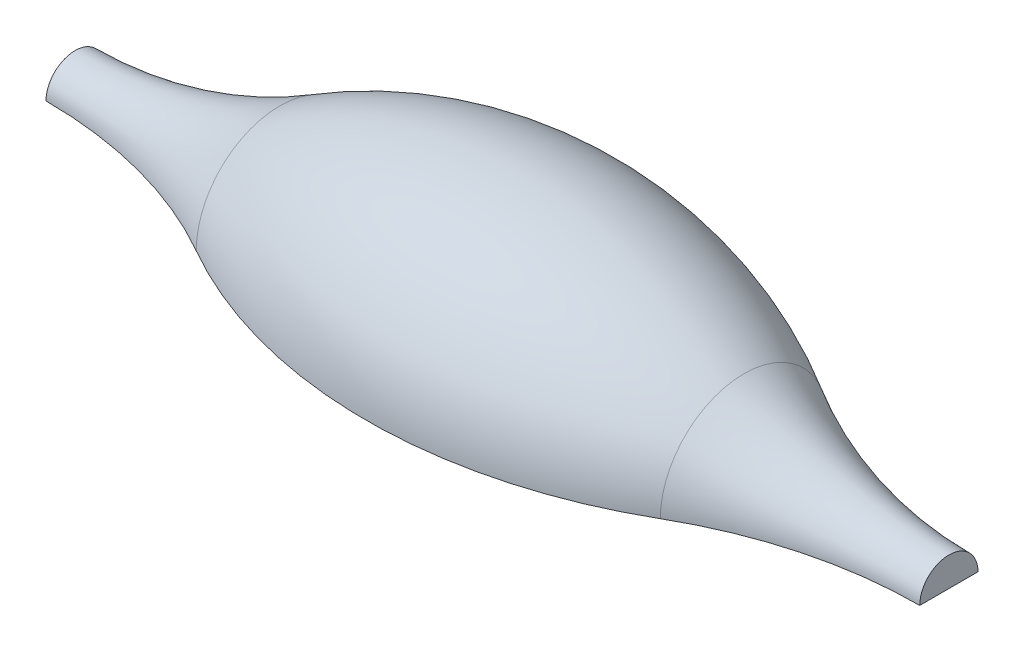
ISO-10303-21;
HEADER;
FILE_DESCRIPTION(('STEP AP214'),'2;1');
FILE_NAME('part.step','',(''),(''),'','','');
FILE_SCHEMA(('AUTOMOTIVE_DESIGN { 1 0 10303 214 1 1 1 1 }'));
ENDSEC;
DATA;
#1=APPLICATION_CONTEXT('core data for automotive mechanical design processes');
#2=APPLICATION_PROTOCOL_DEFINITION('international standard','automotive_design',2000,#1);
#3=PRODUCT_CONTEXT('',#1,'mechanical');
#4=PRODUCT('Part','Part','',(#3));
#5=PRODUCT_RELATED_PRODUCT_CATEGORY('part','',(#4));
#6=PRODUCT_DEFINITION_FORMATION('','',#4);
#7=PRODUCT_DEFINITION_CONTEXT('part definition',#1,'design');
#8=PRODUCT_DEFINITION('design','',#6,#7);
#9=PRODUCT_DEFINITION_SHAPE('','',#8);
#10=(LENGTH_UNIT() NAMED_UNIT(*) SI_UNIT(.MILLI.,.METRE.));
#11=(NAMED_UNIT(*) PLANE_ANGLE_UNIT() SI_UNIT($,.RADIAN.));
#12=(NAMED_UNIT(*) SI_UNIT($,.STERADIAN.) SOLID_ANGLE_UNIT());
#13=UNCERTAINTY_MEASURE_WITH_UNIT(LENGTH_MEASURE(1.E-05),#10,'distance_accuracy_value','');
#14=(GEOMETRIC_REPRESENTATION_CONTEXT(3) GLOBAL_UNCERTAINTY_ASSIGNED_CONTEXT((#13)) GLOBAL_UNIT_ASSIGNED_CONTEXT((#10,
#11,#12)) REPRESENTATION_CONTEXT('',''));
#15=CARTESIAN_POINT('',(0.,0.,0.));
#16=DIRECTION('',(0.,0.,1.));
#17=DIRECTION('',(1.,0.,0.));
#18=AXIS2_PLACEMENT_3D('',#15,#16,#17);
#19=CARTESIAN_POINT('',(-4572.,0.,0.));
#20=DIRECTION('',(1.,0.,0.));
#21=DIRECTION('',(0.,0.,-1.));
#22=AXIS2_PLACEMENT_3D('',#19,#20,#21);
#23=PLANE('',#22);
#24=CARTESIAN_POINT('',(-4572.,0.,0.));
#25=DIRECTION('',(-1.,0.,0.));
#26=DIRECTION('',(0.,0.,1.));
#27=AXIS2_PLACEMENT_3D('',#24,#25,#26);
#28=CIRCLE('',#27,304.8);
#29=CARTESIAN_POINT('',(-4572.,-1.06420412846614E-12,304.8));
#30=VERTEX_POINT('',#29);
#31=CARTESIAN_POINT('',(-4572.,-1.06420412846614E-12,-304.8));
#32=VERTEX_POINT('',#31);
#33=EDGE_CURVE('E11',#30,#32,#28,.T.);
#34=ORIENTED_EDGE('',*,*,#33,.T.);
#35=DIRECTION('',(0.,0.,-1.));
#36=VECTOR('',#35,1.);
#37=CARTESIAN_POINT('',(-4572.,0.,0.));
#38=LINE('',#37,#36);
#39=EDGE_CURVE('E87',#30,#32,#38,.T.);
#40=ORIENTED_EDGE('',*,*,#39,.F.);
#41=EDGE_LOOP('',(#34,#40));
#42=FACE_BOUND('',#41,.T.);
#43=ADVANCED_FACE('F31',(#42),#23,.F.);
#44=CARTESIAN_POINT('',(-4572.,0.,0.));
#45=DIRECTION('',(-1.,0.,0.));
#46=DIRECTION('',(0.,0.,1.));
#47=AXIS2_PLACEMENT_3D('',#44,#45,#46);
#48=TOROIDAL_SURFACE('',#47,4610.10000000001,4305.30000000001);
#49=CARTESIAN_POINT('',(-2428.28215767634,0.,0.));
#50=DIRECTION('',(-1.,0.,0.));
#51=DIRECTION('',(0.,0.,1.));
#52=AXIS2_PLACEMENT_3D('',#49,#50,#51);
#53=CIRCLE('',#52,876.458091286308);
#54=CARTESIAN_POINT('',(-2428.28215767634,-3.06013884243583E-12,876.458091286308));
#55=VERTEX_POINT('',#54);
#56=CARTESIAN_POINT('',(-2428.28215767634,-3.06013884243583E-12,-876.458091286308));
#57=VERTEX_POINT('',#56);
#58=EDGE_CURVE('E38',#55,#57,#53,.T.);
#59=ORIENTED_EDGE('',*,*,#58,.T.);
#60=CARTESIAN_POINT('',(-4572.,-1.60960874430504E-11,-4610.10000000001));
#61=DIRECTION('',(0.,-1.,0.));
#62=DIRECTION('',(-1.,0.,0.));
#63=AXIS2_PLACEMENT_3D('',#60,#61,#62);
#64=CIRCLE('',#63,4305.30000000001);
#65=EDGE_CURVE('E79',#57,#32,#64,.T.);
#66=ORIENTED_EDGE('',*,*,#65,.T.);
#67=ORIENTED_EDGE('',*,*,#33,.F.);
#68=CARTESIAN_POINT('',(-4572.,-1.60960874430504E-11,4610.10000000001));
#69=DIRECTION('',(0.,1.,0.));
#70=DIRECTION('',(-1.,0.,0.));
#71=AXIS2_PLACEMENT_3D('',#68,#69,#70);
#72=CIRCLE('',#71,4305.30000000001);
#73=EDGE_CURVE('E99',#55,#30,#72,.T.);
#74=ORIENTED_EDGE('',*,*,#73,.F.);
#75=EDGE_LOOP('',(#59,#66,#67,#74));
#76=FACE_BOUND('',#75,.T.);
#77=ADVANCED_FACE('F102',(#76),#48,.F.);
#78=CARTESIAN_POINT('',(0.,0.,0.));
#79=DIRECTION('',(-1.,0.,0.));
#80=DIRECTION('',(0.,0.,1.));
#81=AXIS2_PLACEMENT_3D('',#78,#79,#80);
#82=DEGENERATE_TOROIDAL_SURFACE('',#81,3352.8,4876.8,.F.);
#83=CARTESIAN_POINT('',(2428.28215767635,0.,0.));
#84=DIRECTION('',(-1.,0.,0.));
#85=DIRECTION('',(0.,0.,1.));
#86=AXIS2_PLACEMENT_3D('',#83,#84,#85);
#87=CIRCLE('',#86,876.458091286308);
#88=CARTESIAN_POINT('',(2428.28215767635,-3.06013884243583E-12,876.458091286308));
#89=VERTEX_POINT('',#88);
#90=CARTESIAN_POINT('',(2428.28215767635,-3.06013884243583E-12,-876.458091286308));
#91=VERTEX_POINT('',#90);
#92=EDGE_CURVE('E86',#89,#91,#87,.T.);
#93=ORIENTED_EDGE('',*,*,#92,.T.);
#94=CARTESIAN_POINT('',(0.,1.17062454131275E-11,3352.8));
#95=DIRECTION('',(0.,1.,0.));
#96=DIRECTION('',(-1.,0.,0.));
#97=AXIS2_PLACEMENT_3D('',#94,#95,#96);
#98=CIRCLE('',#97,4876.8);
#99=EDGE_CURVE('E91',#91,#57,#98,.T.);
#100=ORIENTED_EDGE('',*,*,#99,.T.);
#101=ORIENTED_EDGE('',*,*,#58,.F.);
#102=CARTESIAN_POINT('',(0.,1.17062454131275E-11,-3352.8));
#103=DIRECTION('',(0.,-1.,0.));
#104=DIRECTION('',(-1.,0.,0.));
#105=AXIS2_PLACEMENT_3D('',#102,#103,#104);
#106=CIRCLE('',#105,4876.8);
#107=EDGE_CURVE('E97',#89,#55,#106,.T.);
#108=ORIENTED_EDGE('',*,*,#107,.F.);
#109=EDGE_LOOP('',(#93,#100,#101,#108));
#110=FACE_BOUND('',#109,.T.);
#111=ADVANCED_FACE('F103',(#110),#82,.F.);
#112=CARTESIAN_POINT('',(4572.,0.,0.));
#113=DIRECTION('',(-1.,0.,0.));
#114=DIRECTION('',(0.,0.,1.));
#115=AXIS2_PLACEMENT_3D('',#112,#113,#114);
#116=TOROIDAL_SURFACE('',#115,4610.10000000001,4305.30000000001);
#117=CARTESIAN_POINT('',(4572.,0.,0.));
#118=DIRECTION('',(-1.,0.,0.));
#119=DIRECTION('',(0.,0.,1.));
#120=AXIS2_PLACEMENT_3D('',#117,#118,#119);
#121=CIRCLE('',#120,304.8);
#122=CARTESIAN_POINT('',(4572.,-1.06420412846614E-12,304.8));
#123=VERTEX_POINT('',#122);
#124=CARTESIAN_POINT('',(4572.,-1.06420412846614E-12,-304.8));
#125=VERTEX_POINT('',#124);
#126=EDGE_CURVE('E73',#123,#125,#121,.T.);
#127=ORIENTED_EDGE('',*,*,#126,.T.);
#128=CARTESIAN_POINT('',(4572.,-1.60960874430504E-11,-4610.10000000001));
#129=DIRECTION('',(0.,-1.,0.));
#130=DIRECTION('',(1.,0.,0.));
#131=AXIS2_PLACEMENT_3D('',#128,#129,#130);
#132=CIRCLE('',#131,4305.30000000001);
#133=EDGE_CURVE('E84',#125,#91,#132,.T.);
#134=ORIENTED_EDGE('',*,*,#133,.T.);
#135=ORIENTED_EDGE('',*,*,#92,.F.);
#136=CARTESIAN_POINT('',(4572.,-1.60960874430504E-11,4610.10000000001));
#137=DIRECTION('',(0.,1.,0.));
#138=DIRECTION('',(1.,0.,0.));
#139=AXIS2_PLACEMENT_3D('',#136,#137,#138);
#140=CIRCLE('',#139,4305.30000000001);
#141=EDGE_CURVE('E78',#123,#89,#140,.T.);
#142=ORIENTED_EDGE('',*,*,#141,.F.);
#143=EDGE_LOOP('',(#127,#134,#135,#142));
#144=FACE_BOUND('',#143,.T.);
#145=ADVANCED_FACE('F83',(#144),#116,.F.);
#146=CARTESIAN_POINT('',(4572.,-1.06420412846614E-12,304.8));
#147=DIRECTION('',(-1.,0.,0.));
#148=DIRECTION('',(0.,0.,1.));
#149=AXIS2_PLACEMENT_3D('',#146,#147,#148);
#150=PLANE('',#149);
#151=DIRECTION('',(0.,0.,1.));
#152=VECTOR('',#151,1.);
#153=CARTESIAN_POINT('',(4572.,-1.06420412846614E-12,304.8));
#154=LINE('',#153,#152);
#155=EDGE_CURVE('E70',#125,#123,#154,.T.);
#156=ORIENTED_EDGE('',*,*,#155,.F.);
#157=ORIENTED_EDGE('',*,*,#126,.F.);
#158=EDGE_LOOP('',(#156,#157));
#159=FACE_BOUND('',#158,.T.);
#160=ADVANCED_FACE('F72',(#159),#150,.F.);
#161=CARTESIAN_POINT('',(-4572.,-1.60960874430504E-11,4610.10000000001));
#162=DIRECTION('',(0.,1.,0.));
#163=DIRECTION('',(-1.,0.,0.));
#164=AXIS2_PLACEMENT_3D('',#161,#162,#163);
#165=PLANE('',#164);
#166=ORIENTED_EDGE('',*,*,#39,.T.);
#167=ORIENTED_EDGE('',*,*,#65,.F.);
#168=ORIENTED_EDGE('',*,*,#99,.F.);
#169=ORIENTED_EDGE('',*,*,#133,.F.);
#170=ORIENTED_EDGE('',*,*,#155,.T.);
#171=ORIENTED_EDGE('',*,*,#141,.T.);
#172=ORIENTED_EDGE('',*,*,#107,.T.);
#173=ORIENTED_EDGE('',*,*,#73,.T.);
#174=EDGE_LOOP('',(#166,#167,#168,#169,#170,#171,#172,#173));
#175=FACE_BOUND('',#174,.T.);
#176=ADVANCED_FACE('F89',(#175),#165,.F.);
#177=CLOSED_SHELL('',(#43,#77,#111,#145,#160,#176));
#178=MANIFOLD_SOLID_BREP('B2',#177);
#179=ADVANCED_BREP_SHAPE_REPRESENTATION('',(#18,#178),#14);
#180=SHAPE_DEFINITION_REPRESENTATION(#9,#179);
ENDSEC;
END-ISO-10303-21;
